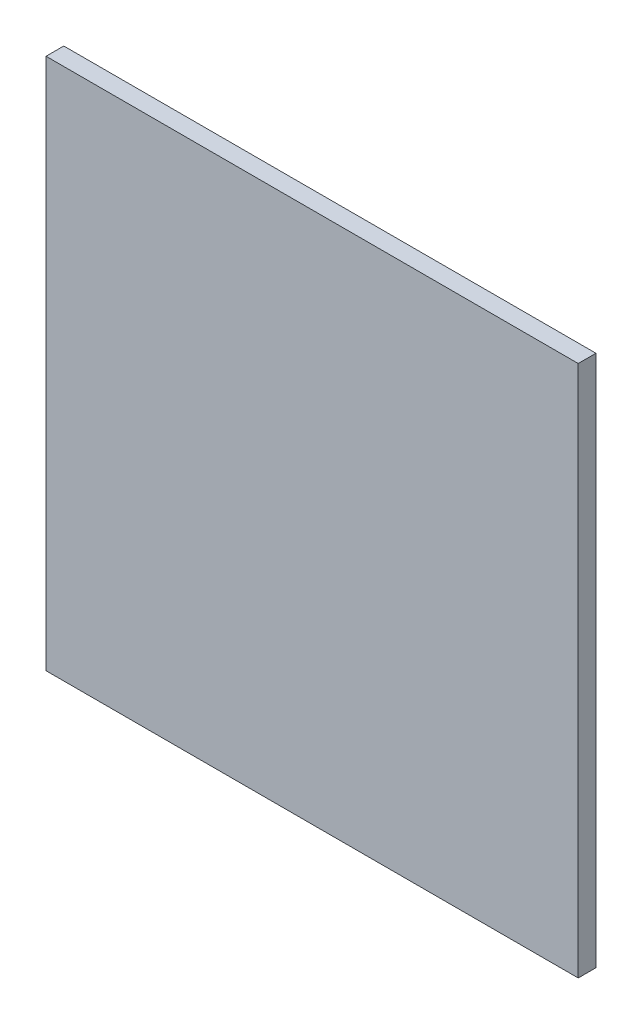
ISO-10303-21;
HEADER;
FILE_DESCRIPTION(('STEP AP214'),'2;1');
FILE_NAME('part.step','',(''),(''),'','','');
FILE_SCHEMA(('AUTOMOTIVE_DESIGN { 1 0 10303 214 1 1 1 1 }'));
ENDSEC;
DATA;
#1=APPLICATION_CONTEXT('core data for automotive mechanical design processes');
#2=APPLICATION_PROTOCOL_DEFINITION('international standard','automotive_design',2000,#1);
#3=PRODUCT_CONTEXT('',#1,'mechanical');
#4=PRODUCT('Part','Part','',(#3));
#5=PRODUCT_RELATED_PRODUCT_CATEGORY('part','',(#4));
#6=PRODUCT_DEFINITION_FORMATION('','',#4);
#7=PRODUCT_DEFINITION_CONTEXT('part definition',#1,'design');
#8=PRODUCT_DEFINITION('design','',#6,#7);
#9=PRODUCT_DEFINITION_SHAPE('','',#8);
#10=(LENGTH_UNIT() NAMED_UNIT(*) SI_UNIT(.MILLI.,.METRE.));
#11=(NAMED_UNIT(*) PLANE_ANGLE_UNIT() SI_UNIT($,.RADIAN.));
#12=(NAMED_UNIT(*) SI_UNIT($,.STERADIAN.) SOLID_ANGLE_UNIT());
#13=UNCERTAINTY_MEASURE_WITH_UNIT(LENGTH_MEASURE(1.E-05),#10,'distance_accuracy_value','');
#14=(GEOMETRIC_REPRESENTATION_CONTEXT(3) GLOBAL_UNCERTAINTY_ASSIGNED_CONTEXT((#13)) GLOBAL_UNIT_ASSIGNED_CONTEXT((#10,
#11,#12)) REPRESENTATION_CONTEXT('',''));
#15=CARTESIAN_POINT('',(0.,0.,0.));
#16=DIRECTION('',(0.,0.,1.));
#17=DIRECTION('',(1.,0.,0.));
#18=AXIS2_PLACEMENT_3D('',#15,#16,#17);
#19=CARTESIAN_POINT('',(-30.,30.,2.));
#20=DIRECTION('',(1.,0.,0.));
#21=DIRECTION('',(0.,0.,-1.));
#22=AXIS2_PLACEMENT_3D('',#19,#20,#21);
#23=PLANE('',#22);
#24=DIRECTION('',(0.,-1.,0.));
#25=VECTOR('',#24,1.);
#26=CARTESIAN_POINT('',(-30.,30.,0.));
#27=LINE('',#26,#25);
#28=CARTESIAN_POINT('',(-30.,30.,0.));
#29=VERTEX_POINT('',#28);
#30=CARTESIAN_POINT('',(-30.,-30.,0.));
#31=VERTEX_POINT('',#30);
#32=EDGE_CURVE('E114',#29,#31,#27,.T.);
#33=ORIENTED_EDGE('',*,*,#32,.T.);
#34=DIRECTION('',(0.,0.,-1.));
#35=VECTOR('',#34,1.);
#36=CARTESIAN_POINT('',(-30.,-30.,2.));
#37=LINE('',#36,#35);
#38=CARTESIAN_POINT('',(-30.,-30.,2.));
#39=VERTEX_POINT('',#38);
#40=EDGE_CURVE('E11',#39,#31,#37,.T.);
#41=ORIENTED_EDGE('',*,*,#40,.F.);
#42=DIRECTION('',(0.,-1.,0.));
#43=VECTOR('',#42,1.);
#44=CARTESIAN_POINT('',(-30.,30.,2.));
#45=LINE('',#44,#43);
#46=CARTESIAN_POINT('',(-30.,30.,2.));
#47=VERTEX_POINT('',#46);
#48=EDGE_CURVE('E98',#47,#39,#45,.T.);
#49=ORIENTED_EDGE('',*,*,#48,.F.);
#50=DIRECTION('',(0.,0.,-1.));
#51=VECTOR('',#50,1.);
#52=CARTESIAN_POINT('',(-30.,30.,2.));
#53=LINE('',#52,#51);
#54=EDGE_CURVE('E110',#47,#29,#53,.T.);
#55=ORIENTED_EDGE('',*,*,#54,.T.);
#56=EDGE_LOOP('',(#33,#41,#49,#55));
#57=FACE_BOUND('',#56,.T.);
#58=ADVANCED_FACE('F47',(#57),#23,.F.);
#59=CARTESIAN_POINT('',(30.,-30.,2.));
#60=DIRECTION('',(0.,1.,0.));
#61=DIRECTION('',(0.,0.,1.));
#62=AXIS2_PLACEMENT_3D('',#59,#60,#61);
#63=PLANE('',#62);
#64=DIRECTION('',(1.,0.,0.));
#65=VECTOR('',#64,1.);
#66=CARTESIAN_POINT('',(30.,-30.,0.));
#67=LINE('',#66,#65);
#68=CARTESIAN_POINT('',(30.,-30.,0.));
#69=VERTEX_POINT('',#68);
#70=EDGE_CURVE('E103',#31,#69,#67,.T.);
#71=ORIENTED_EDGE('',*,*,#70,.T.);
#72=DIRECTION('',(0.,0.,-1.));
#73=VECTOR('',#72,1.);
#74=CARTESIAN_POINT('',(30.,-30.,2.));
#75=LINE('',#74,#73);
#76=CARTESIAN_POINT('',(30.,-30.,2.));
#77=VERTEX_POINT('',#76);
#78=EDGE_CURVE('E55',#77,#69,#75,.T.);
#79=ORIENTED_EDGE('',*,*,#78,.F.);
#80=DIRECTION('',(1.,0.,0.));
#81=VECTOR('',#80,1.);
#82=CARTESIAN_POINT('',(30.,-30.,2.));
#83=LINE('',#82,#81);
#84=EDGE_CURVE('E93',#39,#77,#83,.T.);
#85=ORIENTED_EDGE('',*,*,#84,.F.);
#86=ORIENTED_EDGE('',*,*,#40,.T.);
#87=EDGE_LOOP('',(#71,#79,#85,#86));
#88=FACE_BOUND('',#87,.T.);
#89=ADVANCED_FACE('F102',(#88),#63,.F.);
#90=CARTESIAN_POINT('',(30.,30.,2.));
#91=DIRECTION('',(-1.,0.,0.));
#92=DIRECTION('',(0.,0.,1.));
#93=AXIS2_PLACEMENT_3D('',#90,#91,#92);
#94=PLANE('',#93);
#95=DIRECTION('',(0.,1.,0.));
#96=VECTOR('',#95,1.);
#97=CARTESIAN_POINT('',(30.,30.,0.));
#98=LINE('',#97,#96);
#99=CARTESIAN_POINT('',(30.,30.,0.));
#100=VERTEX_POINT('',#99);
#101=EDGE_CURVE('E80',#69,#100,#98,.T.);
#102=ORIENTED_EDGE('',*,*,#101,.T.);
#103=DIRECTION('',(0.,0.,-1.));
#104=VECTOR('',#103,1.);
#105=CARTESIAN_POINT('',(30.,30.,2.));
#106=LINE('',#105,#104);
#107=CARTESIAN_POINT('',(30.,30.,2.));
#108=VERTEX_POINT('',#107);
#109=EDGE_CURVE('E104',#108,#100,#106,.T.);
#110=ORIENTED_EDGE('',*,*,#109,.F.);
#111=DIRECTION('',(0.,1.,0.));
#112=VECTOR('',#111,1.);
#113=CARTESIAN_POINT('',(30.,30.,2.));
#114=LINE('',#113,#112);
#115=EDGE_CURVE('E96',#77,#108,#114,.T.);
#116=ORIENTED_EDGE('',*,*,#115,.F.);
#117=ORIENTED_EDGE('',*,*,#78,.T.);
#118=EDGE_LOOP('',(#102,#110,#116,#117));
#119=FACE_BOUND('',#118,.T.);
#120=ADVANCED_FACE('F105',(#119),#94,.F.);
#121=CARTESIAN_POINT('',(30.,30.,2.));
#122=DIRECTION('',(0.,-1.,0.));
#123=DIRECTION('',(0.,0.,-1.));
#124=AXIS2_PLACEMENT_3D('',#121,#122,#123);
#125=PLANE('',#124);
#126=DIRECTION('',(-1.,0.,0.));
#127=VECTOR('',#126,1.);
#128=CARTESIAN_POINT('',(30.,30.,0.));
#129=LINE('',#128,#127);
#130=EDGE_CURVE('E86',#100,#29,#129,.T.);
#131=ORIENTED_EDGE('',*,*,#130,.T.);
#132=ORIENTED_EDGE('',*,*,#54,.F.);
#133=DIRECTION('',(-1.,0.,0.));
#134=VECTOR('',#133,1.);
#135=CARTESIAN_POINT('',(30.,30.,2.));
#136=LINE('',#135,#134);
#137=EDGE_CURVE('E63',#108,#47,#136,.T.);
#138=ORIENTED_EDGE('',*,*,#137,.F.);
#139=ORIENTED_EDGE('',*,*,#109,.T.);
#140=EDGE_LOOP('',(#131,#132,#138,#139));
#141=FACE_BOUND('',#140,.T.);
#142=ADVANCED_FACE('F122',(#141),#125,.F.);
#143=CARTESIAN_POINT('',(0.,0.,2.));
#144=DIRECTION('',(0.,0.,-1.));
#145=DIRECTION('',(-1.,0.,0.));
#146=AXIS2_PLACEMENT_3D('',#143,#144,#145);
#147=PLANE('',#146);
#148=ORIENTED_EDGE('',*,*,#48,.T.);
#149=ORIENTED_EDGE('',*,*,#84,.T.);
#150=ORIENTED_EDGE('',*,*,#115,.T.);
#151=ORIENTED_EDGE('',*,*,#137,.T.);
#152=EDGE_LOOP('',(#148,#149,#150,#151));
#153=FACE_BOUND('',#152,.T.);
#154=ADVANCED_FACE('F94',(#153),#147,.F.);
#155=CARTESIAN_POINT('',(0.,0.,0.));
#156=DIRECTION('',(0.,0.,-1.));
#157=DIRECTION('',(-1.,0.,0.));
#158=AXIS2_PLACEMENT_3D('',#155,#156,#157);
#159=PLANE('',#158);
#160=ORIENTED_EDGE('',*,*,#32,.F.);
#161=ORIENTED_EDGE('',*,*,#130,.F.);
#162=ORIENTED_EDGE('',*,*,#101,.F.);
#163=ORIENTED_EDGE('',*,*,#70,.F.);
#164=EDGE_LOOP('',(#160,#161,#162,#163));
#165=FACE_BOUND('',#164,.T.);
#166=ADVANCED_FACE('F125',(#165),#159,.T.);
#167=CLOSED_SHELL('',(#58,#89,#120,#142,#154,#166));
#168=MANIFOLD_SOLID_BREP('B2',#167);
#169=ADVANCED_BREP_SHAPE_REPRESENTATION('',(#18,#168),#14);
#170=SHAPE_DEFINITION_REPRESENTATION(#9,#169);
ENDSEC;
END-ISO-10303-21;
